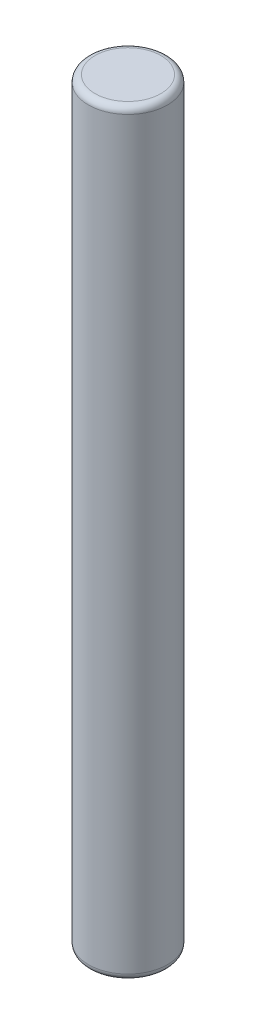
ISO-10303-21;
HEADER;
FILE_DESCRIPTION(('STEP AP214'),'2;1');
FILE_NAME('part.step','',(''),(''),'','','');
FILE_SCHEMA(('AUTOMOTIVE_DESIGN { 1 0 10303 214 1 1 1 1 }'));
ENDSEC;
DATA;
#1=APPLICATION_CONTEXT('core data for automotive mechanical design processes');
#2=APPLICATION_PROTOCOL_DEFINITION('international standard','automotive_design',2000,#1);
#3=PRODUCT_CONTEXT('',#1,'mechanical');
#4=PRODUCT('Part','Part','',(#3));
#5=PRODUCT_RELATED_PRODUCT_CATEGORY('part','',(#4));
#6=PRODUCT_DEFINITION_FORMATION('','',#4);
#7=PRODUCT_DEFINITION_CONTEXT('part definition',#1,'design');
#8=PRODUCT_DEFINITION('design','',#6,#7);
#9=PRODUCT_DEFINITION_SHAPE('','',#8);
#10=(LENGTH_UNIT() NAMED_UNIT(*) SI_UNIT(.MILLI.,.METRE.));
#11=(NAMED_UNIT(*) PLANE_ANGLE_UNIT() SI_UNIT($,.RADIAN.));
#12=(NAMED_UNIT(*) SI_UNIT($,.STERADIAN.) SOLID_ANGLE_UNIT());
#13=UNCERTAINTY_MEASURE_WITH_UNIT(LENGTH_MEASURE(1.E-05),#10,'distance_accuracy_value','');
#14=(GEOMETRIC_REPRESENTATION_CONTEXT(3) GLOBAL_UNCERTAINTY_ASSIGNED_CONTEXT((#13)) GLOBAL_UNIT_ASSIGNED_CONTEXT((#10,
#11,#12)) REPRESENTATION_CONTEXT('',''));
#15=CARTESIAN_POINT('',(0.,0.,0.));
#16=DIRECTION('',(0.,0.,1.));
#17=DIRECTION('',(1.,0.,0.));
#18=AXIS2_PLACEMENT_3D('',#15,#16,#17);
#19=CARTESIAN_POINT('',(0.,11.5,0.));
#20=DIRECTION('',(0.,-1.,0.));
#21=DIRECTION('',(0.,0.,-1.));
#22=AXIS2_PLACEMENT_3D('',#19,#20,#21);
#23=CYLINDRICAL_SURFACE('',#22,0.6);
#24=CARTESIAN_POINT('',(0.,0.1,0.));
#25=DIRECTION('',(0.,1.,0.));
#26=DIRECTION('',(0.,0.,1.));
#27=AXIS2_PLACEMENT_3D('',#24,#25,#26);
#28=CIRCLE('',#27,0.6);
#29=CARTESIAN_POINT('',(0.,0.1,0.6));
#30=VERTEX_POINT('',#29);
#31=EDGE_CURVE('E26',#30,#30,#28,.T.);
#32=ORIENTED_EDGE('',*,*,#31,.T.);
#33=EDGE_LOOP('',(#32));
#34=FACE_BOUND('',#33,.T.);
#35=CARTESIAN_POINT('',(0.,11.4,0.));
#36=DIRECTION('',(0.,1.,0.));
#37=DIRECTION('',(0.,0.,1.));
#38=AXIS2_PLACEMENT_3D('',#35,#36,#37);
#39=CIRCLE('',#38,0.6);
#40=CARTESIAN_POINT('',(0.,11.4,0.6));
#41=VERTEX_POINT('',#40);
#42=EDGE_CURVE('E30',#41,#41,#39,.F.);
#43=ORIENTED_EDGE('',*,*,#42,.T.);
#44=EDGE_LOOP('',(#43));
#45=FACE_BOUND('',#44,.T.);
#46=ADVANCED_FACE('F15',(#34,#45),#23,.T.);
#47=CARTESIAN_POINT('',(0.,11.5,0.));
#48=DIRECTION('',(0.,1.,0.));
#49=DIRECTION('',(0.,0.,1.));
#50=AXIS2_PLACEMENT_3D('',#47,#48,#49);
#51=PLANE('',#50);
#52=CARTESIAN_POINT('',(0.,11.5,0.));
#53=DIRECTION('',(0.,1.,0.));
#54=DIRECTION('',(0.,0.,1.));
#55=AXIS2_PLACEMENT_3D('',#52,#53,#54);
#56=CIRCLE('',#55,0.5);
#57=CARTESIAN_POINT('',(0.,11.5,0.5));
#58=VERTEX_POINT('',#57);
#59=EDGE_CURVE('E10',#58,#58,#56,.T.);
#60=ORIENTED_EDGE('',*,*,#59,.T.);
#61=EDGE_LOOP('',(#60));
#62=FACE_BOUND('',#61,.T.);
#63=ADVANCED_FACE('F48',(#62),#51,.T.);
#64=CARTESIAN_POINT('',(0.,0.,0.));
#65=DIRECTION('',(0.,1.,0.));
#66=DIRECTION('',(0.,0.,1.));
#67=AXIS2_PLACEMENT_3D('',#64,#65,#66);
#68=PLANE('',#67);
#69=CARTESIAN_POINT('',(0.,0.,0.));
#70=DIRECTION('',(0.,1.,0.));
#71=DIRECTION('',(0.,0.,1.));
#72=AXIS2_PLACEMENT_3D('',#69,#70,#71);
#73=CIRCLE('',#72,0.5);
#74=CARTESIAN_POINT('',(0.,0.,0.5));
#75=VERTEX_POINT('',#74);
#76=EDGE_CURVE('E22',#75,#75,#73,.F.);
#77=ORIENTED_EDGE('',*,*,#76,.T.);
#78=EDGE_LOOP('',(#77));
#79=FACE_BOUND('',#78,.T.);
#80=ADVANCED_FACE('F45',(#79),#68,.F.);
#81=CARTESIAN_POINT('',(0.,0.1,0.));
#82=DIRECTION('',(0.,1.,0.));
#83=DIRECTION('',(0.,0.,1.));
#84=AXIS2_PLACEMENT_3D('',#81,#82,#83);
#85=TOROIDAL_SURFACE('',#84,0.5,0.1);
#86=ORIENTED_EDGE('',*,*,#76,.F.);
#87=EDGE_LOOP('',(#86));
#88=FACE_BOUND('',#87,.T.);
#89=ORIENTED_EDGE('',*,*,#31,.F.);
#90=EDGE_LOOP('',(#89));
#91=FACE_BOUND('',#90,.T.);
#92=ADVANCED_FACE('F39',(#88,#91),#85,.T.);
#93=CARTESIAN_POINT('',(0.,11.4,0.));
#94=DIRECTION('',(0.,1.,0.));
#95=DIRECTION('',(0.,0.,1.));
#96=AXIS2_PLACEMENT_3D('',#93,#94,#95);
#97=TOROIDAL_SURFACE('',#96,0.5,0.1);
#98=ORIENTED_EDGE('',*,*,#42,.F.);
#99=EDGE_LOOP('',(#98));
#100=FACE_BOUND('',#99,.T.);
#101=ORIENTED_EDGE('',*,*,#59,.F.);
#102=EDGE_LOOP('',(#101));
#103=FACE_BOUND('',#102,.T.);
#104=ADVANCED_FACE('F17',(#100,#103),#97,.T.);
#105=CLOSED_SHELL('',(#46,#63,#80,#92,#104));
#106=MANIFOLD_SOLID_BREP('B1',#105);
#107=ADVANCED_BREP_SHAPE_REPRESENTATION('',(#18,#106),#14);
#108=SHAPE_DEFINITION_REPRESENTATION(#9,#107);
ENDSEC;
END-ISO-10303-21;
